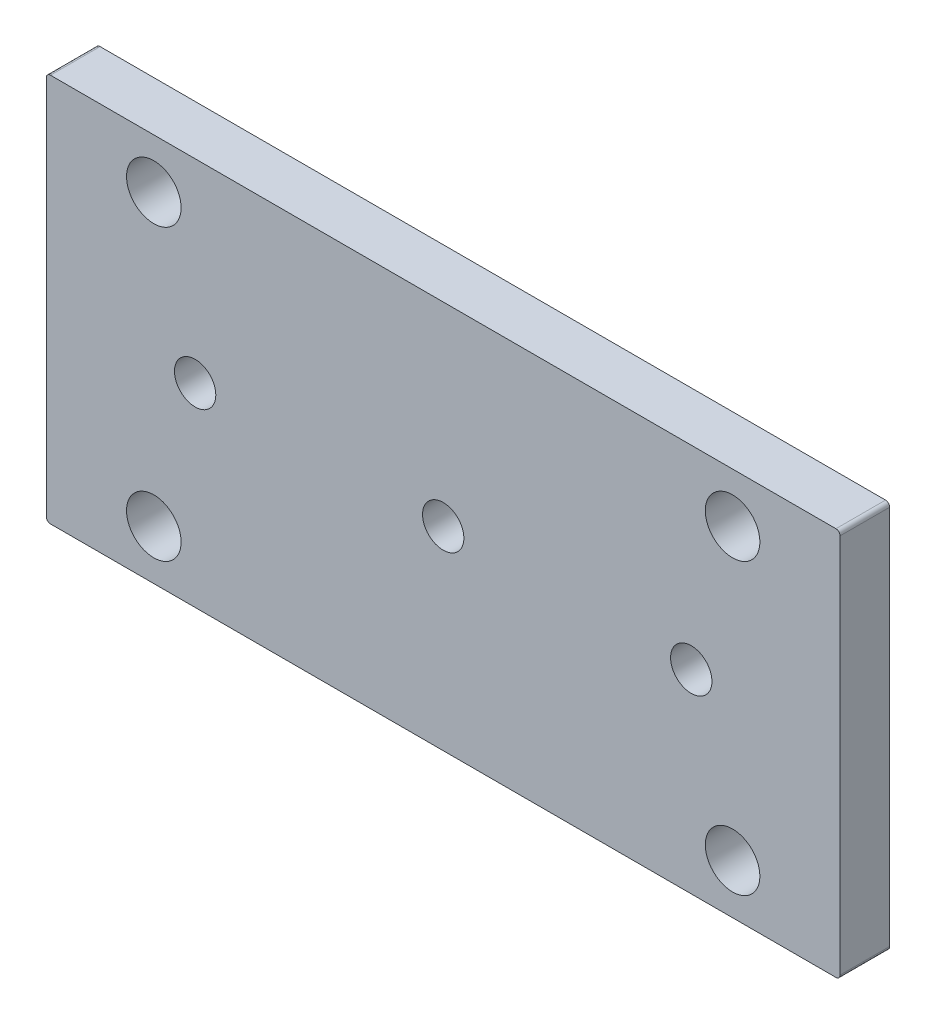
ISO-10303-21;
HEADER;
FILE_DESCRIPTION(('STEP AP214'),'2;1');
FILE_NAME('part.step','',(''),(''),'','','');
FILE_SCHEMA(('AUTOMOTIVE_DESIGN { 1 0 10303 214 1 1 1 1 }'));
ENDSEC;
DATA;
#1=APPLICATION_CONTEXT('core data for automotive mechanical design processes');
#2=APPLICATION_PROTOCOL_DEFINITION('international standard','automotive_design',2000,#1);
#3=PRODUCT_CONTEXT('',#1,'mechanical');
#4=PRODUCT('Part','Part','',(#3));
#5=PRODUCT_RELATED_PRODUCT_CATEGORY('part','',(#4));
#6=PRODUCT_DEFINITION_FORMATION('','',#4);
#7=PRODUCT_DEFINITION_CONTEXT('part definition',#1,'design');
#8=PRODUCT_DEFINITION('design','',#6,#7);
#9=PRODUCT_DEFINITION_SHAPE('','',#8);
#10=(LENGTH_UNIT() NAMED_UNIT(*) SI_UNIT(.MILLI.,.METRE.));
#11=(NAMED_UNIT(*) PLANE_ANGLE_UNIT() SI_UNIT($,.RADIAN.));
#12=(NAMED_UNIT(*) SI_UNIT($,.STERADIAN.) SOLID_ANGLE_UNIT());
#13=UNCERTAINTY_MEASURE_WITH_UNIT(LENGTH_MEASURE(1.E-05),#10,'distance_accuracy_value','');
#14=(GEOMETRIC_REPRESENTATION_CONTEXT(3) GLOBAL_UNCERTAINTY_ASSIGNED_CONTEXT((#13)) GLOBAL_UNIT_ASSIGNED_CONTEXT((#10,
#11,#12)) REPRESENTATION_CONTEXT('',''));
#15=CARTESIAN_POINT('',(0.,0.,0.));
#16=DIRECTION('',(0.,0.,1.));
#17=DIRECTION('',(1.,0.,0.));
#18=AXIS2_PLACEMENT_3D('',#15,#16,#17);
#19=CARTESIAN_POINT('',(0.,0.,6.));
#20=DIRECTION('',(0.,0.,-1.));
#21=DIRECTION('',(-1.,0.,0.));
#22=AXIS2_PLACEMENT_3D('',#19,#20,#21);
#23=PLANE('',#22);
#24=CARTESIAN_POINT('',(18.,-23.5,6.));
#25=DIRECTION('',(0.,0.,1.));
#26=DIRECTION('',(1.,0.,0.));
#27=AXIS2_PLACEMENT_3D('',#24,#25,#26);
#28=CIRCLE('',#27,2.49999999999999);
#29=CARTESIAN_POINT('',(20.5,-23.5,6.));
#30=VERTEX_POINT('',#29);
#31=EDGE_CURVE('E261',#30,#30,#28,.T.);
#32=ORIENTED_EDGE('',*,*,#31,.F.);
#33=EDGE_LOOP('',(#32));
#34=FACE_BOUND('',#33,.T.);
#35=CARTESIAN_POINT('',(48.,-23.5,6.));
#36=DIRECTION('',(0.,0.,1.));
#37=DIRECTION('',(1.,0.,0.));
#38=AXIS2_PLACEMENT_3D('',#35,#36,#37);
#39=CIRCLE('',#38,2.49999999999999);
#40=CARTESIAN_POINT('',(50.5,-23.5,6.));
#41=VERTEX_POINT('',#40);
#42=EDGE_CURVE('E254',#41,#41,#39,.T.);
#43=ORIENTED_EDGE('',*,*,#42,.F.);
#44=EDGE_LOOP('',(#43));
#45=FACE_BOUND('',#44,.T.);
#46=CARTESIAN_POINT('',(78.,-23.5,6.));
#47=DIRECTION('',(0.,0.,1.));
#48=DIRECTION('',(1.,0.,0.));
#49=AXIS2_PLACEMENT_3D('',#46,#47,#48);
#50=CIRCLE('',#49,2.49999999999999);
#51=CARTESIAN_POINT('',(80.5,-23.5,6.));
#52=VERTEX_POINT('',#51);
#53=EDGE_CURVE('E246',#52,#52,#50,.T.);
#54=ORIENTED_EDGE('',*,*,#53,.F.);
#55=EDGE_LOOP('',(#54));
#56=FACE_BOUND('',#55,.T.);
#57=CARTESIAN_POINT('',(13.,-41.,6.));
#58=DIRECTION('',(0.,0.,1.));
#59=DIRECTION('',(1.,0.,0.));
#60=AXIS2_PLACEMENT_3D('',#57,#58,#59);
#61=CIRCLE('',#60,3.3);
#62=CARTESIAN_POINT('',(16.3,-41.,6.));
#63=VERTEX_POINT('',#62);
#64=EDGE_CURVE('E235',#63,#63,#61,.T.);
#65=ORIENTED_EDGE('',*,*,#64,.F.);
#66=EDGE_LOOP('',(#65));
#67=FACE_BOUND('',#66,.T.);
#68=CARTESIAN_POINT('',(83.,-6.,6.));
#69=DIRECTION('',(0.,0.,1.));
#70=DIRECTION('',(1.,0.,0.));
#71=AXIS2_PLACEMENT_3D('',#68,#69,#70);
#72=CIRCLE('',#71,3.29999999999999);
#73=CARTESIAN_POINT('',(86.3,-6.,6.));
#74=VERTEX_POINT('',#73);
#75=EDGE_CURVE('E166',#74,#74,#72,.T.);
#76=ORIENTED_EDGE('',*,*,#75,.F.);
#77=EDGE_LOOP('',(#76));
#78=FACE_BOUND('',#77,.T.);
#79=DIRECTION('',(-1.,0.,0.));
#80=VECTOR('',#79,1.);
#81=CARTESIAN_POINT('',(0.,0.,6.));
#82=LINE('',#81,#80);
#83=CARTESIAN_POINT('',(95.5,0.,6.));
#84=VERTEX_POINT('',#83);
#85=CARTESIAN_POINT('',(0.5,0.,6.));
#86=VERTEX_POINT('',#85);
#87=EDGE_CURVE('E153',#84,#86,#82,.T.);
#88=ORIENTED_EDGE('',*,*,#87,.T.);
#89=CARTESIAN_POINT('',(0.5,-0.5,6.));
#90=DIRECTION('',(0.,0.,-1.));
#91=DIRECTION('',(-1.,0.,0.));
#92=AXIS2_PLACEMENT_3D('',#89,#90,#91);
#93=CIRCLE('',#92,0.5);
#94=CARTESIAN_POINT('',(0.,-0.5,6.));
#95=VERTEX_POINT('',#94);
#96=EDGE_CURVE('E194',#86,#95,#93,.F.);
#97=ORIENTED_EDGE('',*,*,#96,.T.);
#98=DIRECTION('',(0.,-1.,0.));
#99=VECTOR('',#98,1.);
#100=CARTESIAN_POINT('',(0.,-47.,6.));
#101=LINE('',#100,#99);
#102=CARTESIAN_POINT('',(0.,-46.5,6.));
#103=VERTEX_POINT('',#102);
#104=EDGE_CURVE('E130',#95,#103,#101,.T.);
#105=ORIENTED_EDGE('',*,*,#104,.T.);
#106=CARTESIAN_POINT('',(0.5,-46.5,6.));
#107=DIRECTION('',(0.,0.,-1.));
#108=DIRECTION('',(-1.,0.,0.));
#109=AXIS2_PLACEMENT_3D('',#106,#107,#108);
#110=CIRCLE('',#109,0.5);
#111=CARTESIAN_POINT('',(0.500000000000028,-47.,6.));
#112=VERTEX_POINT('',#111);
#113=EDGE_CURVE('E186',#103,#112,#110,.F.);
#114=ORIENTED_EDGE('',*,*,#113,.T.);
#115=DIRECTION('',(1.,0.,0.));
#116=VECTOR('',#115,1.);
#117=CARTESIAN_POINT('',(96.,-47.,6.));
#118=LINE('',#117,#116);
#119=CARTESIAN_POINT('',(95.5,-47.,6.));
#120=VERTEX_POINT('',#119);
#121=EDGE_CURVE('E209',#112,#120,#118,.T.);
#122=ORIENTED_EDGE('',*,*,#121,.T.);
#123=CARTESIAN_POINT('',(95.5,-46.5,6.));
#124=DIRECTION('',(0.,0.,-1.));
#125=DIRECTION('',(-1.,0.,0.));
#126=AXIS2_PLACEMENT_3D('',#123,#124,#125);
#127=CIRCLE('',#126,0.5);
#128=CARTESIAN_POINT('',(96.,-46.5,6.));
#129=VERTEX_POINT('',#128);
#130=EDGE_CURVE('E65',#120,#129,#127,.F.);
#131=ORIENTED_EDGE('',*,*,#130,.T.);
#132=DIRECTION('',(0.,1.,0.));
#133=VECTOR('',#132,1.);
#134=CARTESIAN_POINT('',(96.,0.,6.));
#135=LINE('',#134,#133);
#136=CARTESIAN_POINT('',(96.,-0.5,6.));
#137=VERTEX_POINT('',#136);
#138=EDGE_CURVE('E217',#129,#137,#135,.T.);
#139=ORIENTED_EDGE('',*,*,#138,.T.);
#140=CARTESIAN_POINT('',(95.5,-0.5,6.));
#141=DIRECTION('',(0.,0.,-1.));
#142=DIRECTION('',(-1.,0.,0.));
#143=AXIS2_PLACEMENT_3D('',#140,#141,#142);
#144=CIRCLE('',#143,0.5);
#145=EDGE_CURVE('E191',#137,#84,#144,.F.);
#146=ORIENTED_EDGE('',*,*,#145,.T.);
#147=EDGE_LOOP('',(#88,#97,#105,#114,#122,#131,#139,#146));
#148=FACE_BOUND('',#147,.T.);
#149=CARTESIAN_POINT('',(83.,-41.,6.));
#150=DIRECTION('',(0.,0.,1.));
#151=DIRECTION('',(1.,0.,0.));
#152=AXIS2_PLACEMENT_3D('',#149,#150,#151);
#153=CIRCLE('',#152,3.29999999999999);
#154=CARTESIAN_POINT('',(86.3,-41.,6.));
#155=VERTEX_POINT('',#154);
#156=EDGE_CURVE('E230',#155,#155,#153,.F.);
#157=ORIENTED_EDGE('',*,*,#156,.T.);
#158=EDGE_LOOP('',(#157));
#159=FACE_BOUND('',#158,.T.);
#160=CARTESIAN_POINT('',(13.,-6.00000000000001,6.));
#161=DIRECTION('',(0.,0.,1.));
#162=DIRECTION('',(1.,0.,0.));
#163=AXIS2_PLACEMENT_3D('',#160,#161,#162);
#164=CIRCLE('',#163,3.3);
#165=CARTESIAN_POINT('',(16.3,-6.00000000000001,6.));
#166=VERTEX_POINT('',#165);
#167=EDGE_CURVE('E231',#166,#166,#164,.F.);
#168=ORIENTED_EDGE('',*,*,#167,.T.);
#169=EDGE_LOOP('',(#168));
#170=FACE_BOUND('',#169,.T.);
#171=ADVANCED_FACE('F42',(#34,#45,#56,#67,#78,#148,#159,#170),#23,.F.);
#172=CARTESIAN_POINT('',(0.,0.,0.));
#173=DIRECTION('',(0.,0.,-1.));
#174=DIRECTION('',(-1.,0.,0.));
#175=AXIS2_PLACEMENT_3D('',#172,#173,#174);
#176=PLANE('',#175);
#177=CARTESIAN_POINT('',(18.,-23.5,0.));
#178=DIRECTION('',(0.,0.,1.));
#179=DIRECTION('',(1.,0.,0.));
#180=AXIS2_PLACEMENT_3D('',#177,#178,#179);
#181=CIRCLE('',#180,2.5);
#182=CARTESIAN_POINT('',(20.5,-23.5,0.));
#183=VERTEX_POINT('',#182);
#184=EDGE_CURVE('E258',#183,#183,#181,.T.);
#185=ORIENTED_EDGE('',*,*,#184,.T.);
#186=EDGE_LOOP('',(#185));
#187=FACE_BOUND('',#186,.T.);
#188=CARTESIAN_POINT('',(48.,-23.5,0.));
#189=DIRECTION('',(0.,0.,1.));
#190=DIRECTION('',(1.,0.,0.));
#191=AXIS2_PLACEMENT_3D('',#188,#189,#190);
#192=CIRCLE('',#191,2.5);
#193=CARTESIAN_POINT('',(50.5,-23.5,0.));
#194=VERTEX_POINT('',#193);
#195=EDGE_CURVE('E250',#194,#194,#192,.T.);
#196=ORIENTED_EDGE('',*,*,#195,.T.);
#197=EDGE_LOOP('',(#196));
#198=FACE_BOUND('',#197,.T.);
#199=CARTESIAN_POINT('',(78.,-23.5,0.));
#200=DIRECTION('',(0.,0.,1.));
#201=DIRECTION('',(1.,0.,0.));
#202=AXIS2_PLACEMENT_3D('',#199,#200,#201);
#203=CIRCLE('',#202,2.5);
#204=CARTESIAN_POINT('',(80.5,-23.5,0.));
#205=VERTEX_POINT('',#204);
#206=EDGE_CURVE('E236',#205,#205,#203,.T.);
#207=ORIENTED_EDGE('',*,*,#206,.T.);
#208=EDGE_LOOP('',(#207));
#209=FACE_BOUND('',#208,.T.);
#210=CARTESIAN_POINT('',(83.,-41.,0.));
#211=DIRECTION('',(0.,0.,-1.));
#212=DIRECTION('',(-1.,0.,0.));
#213=AXIS2_PLACEMENT_3D('',#210,#211,#212);
#214=CIRCLE('',#213,3.29999999999999);
#215=CARTESIAN_POINT('',(79.7,-41.,0.));
#216=VERTEX_POINT('',#215);
#217=EDGE_CURVE('E165',#216,#216,#214,.F.);
#218=ORIENTED_EDGE('',*,*,#217,.T.);
#219=EDGE_LOOP('',(#218));
#220=FACE_BOUND('',#219,.T.);
#221=CARTESIAN_POINT('',(83.,-6.,0.));
#222=DIRECTION('',(0.,0.,-1.));
#223=DIRECTION('',(-1.,0.,0.));
#224=AXIS2_PLACEMENT_3D('',#221,#222,#223);
#225=CIRCLE('',#224,3.29999999999999);
#226=CARTESIAN_POINT('',(79.7,-6.,0.));
#227=VERTEX_POINT('',#226);
#228=EDGE_CURVE('E161',#227,#227,#225,.T.);
#229=ORIENTED_EDGE('',*,*,#228,.F.);
#230=EDGE_LOOP('',(#229));
#231=FACE_BOUND('',#230,.T.);
#232=DIRECTION('',(0.,-1.,0.));
#233=VECTOR('',#232,1.);
#234=CARTESIAN_POINT('',(0.,-47.,0.));
#235=LINE('',#234,#233);
#236=CARTESIAN_POINT('',(0.,-0.5,0.));
#237=VERTEX_POINT('',#236);
#238=CARTESIAN_POINT('',(0.,-46.5,0.));
#239=VERTEX_POINT('',#238);
#240=EDGE_CURVE('E127',#237,#239,#235,.T.);
#241=ORIENTED_EDGE('',*,*,#240,.F.);
#242=CARTESIAN_POINT('',(0.5,-0.5,0.));
#243=DIRECTION('',(0.,0.,-1.));
#244=DIRECTION('',(-1.,0.,0.));
#245=AXIS2_PLACEMENT_3D('',#242,#243,#244);
#246=CIRCLE('',#245,0.5);
#247=CARTESIAN_POINT('',(0.5,0.,0.));
#248=VERTEX_POINT('',#247);
#249=EDGE_CURVE('E109',#237,#248,#246,.T.);
#250=ORIENTED_EDGE('',*,*,#249,.T.);
#251=DIRECTION('',(-1.,0.,0.));
#252=VECTOR('',#251,1.);
#253=CARTESIAN_POINT('',(0.,0.,0.));
#254=LINE('',#253,#252);
#255=CARTESIAN_POINT('',(95.5,0.,0.));
#256=VERTEX_POINT('',#255);
#257=EDGE_CURVE('E158',#256,#248,#254,.T.);
#258=ORIENTED_EDGE('',*,*,#257,.F.);
#259=CARTESIAN_POINT('',(95.5,-0.5,0.));
#260=DIRECTION('',(0.,0.,-1.));
#261=DIRECTION('',(-1.,0.,0.));
#262=AXIS2_PLACEMENT_3D('',#259,#260,#261);
#263=CIRCLE('',#262,0.5);
#264=CARTESIAN_POINT('',(96.,-0.5,0.));
#265=VERTEX_POINT('',#264);
#266=EDGE_CURVE('E121',#256,#265,#263,.T.);
#267=ORIENTED_EDGE('',*,*,#266,.T.);
#268=DIRECTION('',(0.,1.,0.));
#269=VECTOR('',#268,1.);
#270=CARTESIAN_POINT('',(96.,0.,0.));
#271=LINE('',#270,#269);
#272=CARTESIAN_POINT('',(96.,-46.5,0.));
#273=VERTEX_POINT('',#272);
#274=EDGE_CURVE('E146',#273,#265,#271,.T.);
#275=ORIENTED_EDGE('',*,*,#274,.F.);
#276=CARTESIAN_POINT('',(95.5,-46.5,0.));
#277=DIRECTION('',(0.,0.,-1.));
#278=DIRECTION('',(-1.,0.,0.));
#279=AXIS2_PLACEMENT_3D('',#276,#277,#278);
#280=CIRCLE('',#279,0.5);
#281=CARTESIAN_POINT('',(95.5,-47.,0.));
#282=VERTEX_POINT('',#281);
#283=EDGE_CURVE('E177',#273,#282,#280,.T.);
#284=ORIENTED_EDGE('',*,*,#283,.T.);
#285=DIRECTION('',(1.,0.,0.));
#286=VECTOR('',#285,1.);
#287=CARTESIAN_POINT('',(96.,-47.,0.));
#288=LINE('',#287,#286);
#289=CARTESIAN_POINT('',(0.500000000000028,-47.,0.));
#290=VERTEX_POINT('',#289);
#291=EDGE_CURVE('E139',#290,#282,#288,.T.);
#292=ORIENTED_EDGE('',*,*,#291,.F.);
#293=CARTESIAN_POINT('',(0.5,-46.5,0.));
#294=DIRECTION('',(0.,0.,-1.));
#295=DIRECTION('',(-1.,0.,0.));
#296=AXIS2_PLACEMENT_3D('',#293,#294,#295);
#297=CIRCLE('',#296,0.5);
#298=EDGE_CURVE('E132',#290,#239,#297,.T.);
#299=ORIENTED_EDGE('',*,*,#298,.T.);
#300=EDGE_LOOP('',(#241,#250,#258,#267,#275,#284,#292,#299));
#301=FACE_BOUND('',#300,.T.);
#302=CARTESIAN_POINT('',(13.,-41.,0.));
#303=DIRECTION('',(0.,0.,-1.));
#304=DIRECTION('',(-1.,0.,0.));
#305=AXIS2_PLACEMENT_3D('',#302,#303,#304);
#306=CIRCLE('',#305,3.3);
#307=CARTESIAN_POINT('',(9.70000000000001,-41.,0.));
#308=VERTEX_POINT('',#307);
#309=EDGE_CURVE('E150',#308,#308,#306,.T.);
#310=ORIENTED_EDGE('',*,*,#309,.F.);
#311=EDGE_LOOP('',(#310));
#312=FACE_BOUND('',#311,.T.);
#313=CARTESIAN_POINT('',(13.,-6.00000000000001,0.));
#314=DIRECTION('',(0.,0.,-1.));
#315=DIRECTION('',(-1.,0.,0.));
#316=AXIS2_PLACEMENT_3D('',#313,#314,#315);
#317=CIRCLE('',#316,3.3);
#318=CARTESIAN_POINT('',(9.7,-6.00000000000001,0.));
#319=VERTEX_POINT('',#318);
#320=EDGE_CURVE('E140',#319,#319,#317,.F.);
#321=ORIENTED_EDGE('',*,*,#320,.T.);
#322=EDGE_LOOP('',(#321));
#323=FACE_BOUND('',#322,.T.);
#324=ADVANCED_FACE('F135',(#187,#198,#209,#220,#231,#301,#312,#323),#176,.T.);
#325=CARTESIAN_POINT('',(0.,-47.,6.));
#326=DIRECTION('',(1.,0.,0.));
#327=DIRECTION('',(0.,1.,0.));
#328=AXIS2_PLACEMENT_3D('',#325,#326,#327);
#329=PLANE('',#328);
#330=ORIENTED_EDGE('',*,*,#104,.F.);
#331=DIRECTION('',(0.,0.,-1.));
#332=VECTOR('',#331,1.);
#333=CARTESIAN_POINT('',(0.,-0.5,6.));
#334=LINE('',#333,#332);
#335=EDGE_CURVE('E113',#95,#237,#334,.T.);
#336=ORIENTED_EDGE('',*,*,#335,.T.);
#337=ORIENTED_EDGE('',*,*,#240,.T.);
#338=DIRECTION('',(0.,0.,-1.));
#339=VECTOR('',#338,1.);
#340=CARTESIAN_POINT('',(0.,-46.5,6.));
#341=LINE('',#340,#339);
#342=EDGE_CURVE('E133',#239,#103,#341,.F.);
#343=ORIENTED_EDGE('',*,*,#342,.T.);
#344=EDGE_LOOP('',(#330,#336,#337,#343));
#345=FACE_BOUND('',#344,.T.);
#346=ADVANCED_FACE('F126',(#345),#329,.F.);
#347=CARTESIAN_POINT('',(96.,-47.,6.));
#348=DIRECTION('',(0.,1.,0.));
#349=DIRECTION('',(-1.,0.,0.));
#350=AXIS2_PLACEMENT_3D('',#347,#348,#349);
#351=PLANE('',#350);
#352=ORIENTED_EDGE('',*,*,#291,.T.);
#353=DIRECTION('',(0.,0.,-1.));
#354=VECTOR('',#353,1.);
#355=CARTESIAN_POINT('',(95.5,-47.,6.));
#356=LINE('',#355,#354);
#357=EDGE_CURVE('E11',#282,#120,#356,.F.);
#358=ORIENTED_EDGE('',*,*,#357,.T.);
#359=ORIENTED_EDGE('',*,*,#121,.F.);
#360=DIRECTION('',(0.,0.,-1.));
#361=VECTOR('',#360,1.);
#362=CARTESIAN_POINT('',(0.5,-47.,6.));
#363=LINE('',#362,#361);
#364=EDGE_CURVE('E51',#112,#290,#363,.T.);
#365=ORIENTED_EDGE('',*,*,#364,.T.);
#366=EDGE_LOOP('',(#352,#358,#359,#365));
#367=FACE_BOUND('',#366,.T.);
#368=ADVANCED_FACE('F207',(#367),#351,.F.);
#369=CARTESIAN_POINT('',(96.,0.,6.));
#370=DIRECTION('',(-1.,0.,0.));
#371=DIRECTION('',(0.,-1.,0.));
#372=AXIS2_PLACEMENT_3D('',#369,#370,#371);
#373=PLANE('',#372);
#374=ORIENTED_EDGE('',*,*,#274,.T.);
#375=DIRECTION('',(0.,0.,-1.));
#376=VECTOR('',#375,1.);
#377=CARTESIAN_POINT('',(96.,-0.5,6.));
#378=LINE('',#377,#376);
#379=EDGE_CURVE('E58',#265,#137,#378,.F.);
#380=ORIENTED_EDGE('',*,*,#379,.T.);
#381=ORIENTED_EDGE('',*,*,#138,.F.);
#382=DIRECTION('',(0.,0.,-1.));
#383=VECTOR('',#382,1.);
#384=CARTESIAN_POINT('',(96.,-46.5,6.));
#385=LINE('',#384,#383);
#386=EDGE_CURVE('E197',#129,#273,#385,.T.);
#387=ORIENTED_EDGE('',*,*,#386,.T.);
#388=EDGE_LOOP('',(#374,#380,#381,#387));
#389=FACE_BOUND('',#388,.T.);
#390=ADVANCED_FACE('F216',(#389),#373,.F.);
#391=CARTESIAN_POINT('',(0.,0.,6.));
#392=DIRECTION('',(0.,-1.,0.));
#393=DIRECTION('',(0.,0.,-1.));
#394=AXIS2_PLACEMENT_3D('',#391,#392,#393);
#395=PLANE('',#394);
#396=ORIENTED_EDGE('',*,*,#257,.T.);
#397=DIRECTION('',(0.,0.,-1.));
#398=VECTOR('',#397,1.);
#399=CARTESIAN_POINT('',(0.5,0.,6.));
#400=LINE('',#399,#398);
#401=EDGE_CURVE('E114',#248,#86,#400,.F.);
#402=ORIENTED_EDGE('',*,*,#401,.T.);
#403=ORIENTED_EDGE('',*,*,#87,.F.);
#404=DIRECTION('',(0.,0.,-1.));
#405=VECTOR('',#404,1.);
#406=CARTESIAN_POINT('',(95.5,0.,6.));
#407=LINE('',#406,#405);
#408=EDGE_CURVE('E120',#84,#256,#407,.T.);
#409=ORIENTED_EDGE('',*,*,#408,.T.);
#410=EDGE_LOOP('',(#396,#402,#403,#409));
#411=FACE_BOUND('',#410,.T.);
#412=ADVANCED_FACE('F305',(#411),#395,.F.);
#413=CARTESIAN_POINT('',(83.,-6.,-4.));
#414=DIRECTION('',(0.,0.,1.));
#415=DIRECTION('',(1.,0.,0.));
#416=AXIS2_PLACEMENT_3D('',#413,#414,#415);
#417=CYLINDRICAL_SURFACE('',#416,3.29999999999999);
#418=ORIENTED_EDGE('',*,*,#228,.T.);
#419=EDGE_LOOP('',(#418));
#420=FACE_BOUND('',#419,.T.);
#421=ORIENTED_EDGE('',*,*,#75,.T.);
#422=EDGE_LOOP('',(#421));
#423=FACE_BOUND('',#422,.T.);
#424=ADVANCED_FACE('F303',(#420,#423),#417,.F.);
#425=CARTESIAN_POINT('',(83.,-41.,-4.));
#426=DIRECTION('',(0.,0.,1.));
#427=DIRECTION('',(1.,0.,0.));
#428=AXIS2_PLACEMENT_3D('',#425,#426,#427);
#429=CYLINDRICAL_SURFACE('',#428,3.29999999999999);
#430=ORIENTED_EDGE('',*,*,#217,.F.);
#431=EDGE_LOOP('',(#430));
#432=FACE_BOUND('',#431,.T.);
#433=ORIENTED_EDGE('',*,*,#156,.F.);
#434=EDGE_LOOP('',(#433));
#435=FACE_BOUND('',#434,.T.);
#436=ADVANCED_FACE('F297',(#432,#435),#429,.F.);
#437=CARTESIAN_POINT('',(13.,-41.,-4.));
#438=DIRECTION('',(0.,0.,1.));
#439=DIRECTION('',(1.,0.,0.));
#440=AXIS2_PLACEMENT_3D('',#437,#438,#439);
#441=CYLINDRICAL_SURFACE('',#440,3.3);
#442=ORIENTED_EDGE('',*,*,#309,.T.);
#443=EDGE_LOOP('',(#442));
#444=FACE_BOUND('',#443,.T.);
#445=ORIENTED_EDGE('',*,*,#64,.T.);
#446=EDGE_LOOP('',(#445));
#447=FACE_BOUND('',#446,.T.);
#448=ADVANCED_FACE('F287',(#444,#447),#441,.F.);
#449=CARTESIAN_POINT('',(13.,-6.00000000000001,-4.));
#450=DIRECTION('',(0.,0.,1.));
#451=DIRECTION('',(1.,0.,0.));
#452=AXIS2_PLACEMENT_3D('',#449,#450,#451);
#453=CYLINDRICAL_SURFACE('',#452,3.3);
#454=ORIENTED_EDGE('',*,*,#320,.F.);
#455=EDGE_LOOP('',(#454));
#456=FACE_BOUND('',#455,.T.);
#457=ORIENTED_EDGE('',*,*,#167,.F.);
#458=EDGE_LOOP('',(#457));
#459=FACE_BOUND('',#458,.T.);
#460=ADVANCED_FACE('F284',(#456,#459),#453,.F.);
#461=CARTESIAN_POINT('',(78.,-23.5,6.));
#462=DIRECTION('',(0.,0.,1.));
#463=DIRECTION('',(1.,0.,0.));
#464=AXIS2_PLACEMENT_3D('',#461,#462,#463);
#465=CYLINDRICAL_SURFACE('',#464,2.5);
#466=ORIENTED_EDGE('',*,*,#206,.F.);
#467=EDGE_LOOP('',(#466));
#468=FACE_BOUND('',#467,.T.);
#469=ORIENTED_EDGE('',*,*,#53,.T.);
#470=EDGE_LOOP('',(#469));
#471=FACE_BOUND('',#470,.T.);
#472=ADVANCED_FACE('F286',(#468,#471),#465,.F.);
#473=CARTESIAN_POINT('',(48.,-23.5,6.));
#474=DIRECTION('',(0.,0.,1.));
#475=DIRECTION('',(1.,0.,0.));
#476=AXIS2_PLACEMENT_3D('',#473,#474,#475);
#477=CYLINDRICAL_SURFACE('',#476,2.49999999999999);
#478=ORIENTED_EDGE('',*,*,#195,.F.);
#479=EDGE_LOOP('',(#478));
#480=FACE_BOUND('',#479,.T.);
#481=ORIENTED_EDGE('',*,*,#42,.T.);
#482=EDGE_LOOP('',(#481));
#483=FACE_BOUND('',#482,.T.);
#484=ADVANCED_FACE('F294',(#480,#483),#477,.F.);
#485=CARTESIAN_POINT('',(18.,-23.5,6.));
#486=DIRECTION('',(0.,0.,1.));
#487=DIRECTION('',(1.,0.,0.));
#488=AXIS2_PLACEMENT_3D('',#485,#486,#487);
#489=CYLINDRICAL_SURFACE('',#488,2.49999999999999);
#490=ORIENTED_EDGE('',*,*,#184,.F.);
#491=EDGE_LOOP('',(#490));
#492=FACE_BOUND('',#491,.T.);
#493=ORIENTED_EDGE('',*,*,#31,.T.);
#494=EDGE_LOOP('',(#493));
#495=FACE_BOUND('',#494,.T.);
#496=ADVANCED_FACE('F266',(#492,#495),#489,.F.);
#497=CARTESIAN_POINT('',(0.5,-0.5,6.));
#498=DIRECTION('',(0.,0.,-1.));
#499=DIRECTION('',(-1.,0.,0.));
#500=AXIS2_PLACEMENT_3D('',#497,#498,#499);
#501=CYLINDRICAL_SURFACE('',#500,0.5);
#502=ORIENTED_EDGE('',*,*,#96,.F.);
#503=ORIENTED_EDGE('',*,*,#401,.F.);
#504=ORIENTED_EDGE('',*,*,#249,.F.);
#505=ORIENTED_EDGE('',*,*,#335,.F.);
#506=EDGE_LOOP('',(#502,#503,#504,#505));
#507=FACE_BOUND('',#506,.T.);
#508=ADVANCED_FACE('F112',(#507),#501,.T.);
#509=CARTESIAN_POINT('',(95.5,-0.5,6.));
#510=DIRECTION('',(0.,0.,-1.));
#511=DIRECTION('',(-1.,0.,0.));
#512=AXIS2_PLACEMENT_3D('',#509,#510,#511);
#513=CYLINDRICAL_SURFACE('',#512,0.5);
#514=ORIENTED_EDGE('',*,*,#145,.F.);
#515=ORIENTED_EDGE('',*,*,#379,.F.);
#516=ORIENTED_EDGE('',*,*,#266,.F.);
#517=ORIENTED_EDGE('',*,*,#408,.F.);
#518=EDGE_LOOP('',(#514,#515,#516,#517));
#519=FACE_BOUND('',#518,.T.);
#520=ADVANCED_FACE('F322',(#519),#513,.T.);
#521=CARTESIAN_POINT('',(95.5,-46.5,6.));
#522=DIRECTION('',(0.,0.,-1.));
#523=DIRECTION('',(-1.,0.,0.));
#524=AXIS2_PLACEMENT_3D('',#521,#522,#523);
#525=CYLINDRICAL_SURFACE('',#524,0.5);
#526=ORIENTED_EDGE('',*,*,#130,.F.);
#527=ORIENTED_EDGE('',*,*,#357,.F.);
#528=ORIENTED_EDGE('',*,*,#283,.F.);
#529=ORIENTED_EDGE('',*,*,#386,.F.);
#530=EDGE_LOOP('',(#526,#527,#528,#529));
#531=FACE_BOUND('',#530,.T.);
#532=ADVANCED_FACE('F215',(#531),#525,.T.);
#533=CARTESIAN_POINT('',(0.5,-46.5,6.));
#534=DIRECTION('',(0.,0.,-1.));
#535=DIRECTION('',(-1.,0.,0.));
#536=AXIS2_PLACEMENT_3D('',#533,#534,#535);
#537=CYLINDRICAL_SURFACE('',#536,0.5);
#538=ORIENTED_EDGE('',*,*,#113,.F.);
#539=ORIENTED_EDGE('',*,*,#342,.F.);
#540=ORIENTED_EDGE('',*,*,#298,.F.);
#541=ORIENTED_EDGE('',*,*,#364,.F.);
#542=EDGE_LOOP('',(#538,#539,#540,#541));
#543=FACE_BOUND('',#542,.T.);
#544=ADVANCED_FACE('F44',(#543),#537,.T.);
#545=CLOSED_SHELL('',(#171,#324,#346,#368,#390,#412,#424,#436,#448,#460,#472,#484,#496,#508,
#520,#532,#544));
#546=MANIFOLD_SOLID_BREP('B2',#545);
#547=ADVANCED_BREP_SHAPE_REPRESENTATION('',(#18,#546),#14);
#548=SHAPE_DEFINITION_REPRESENTATION(#9,#547);
ENDSEC;
END-ISO-10303-21;
